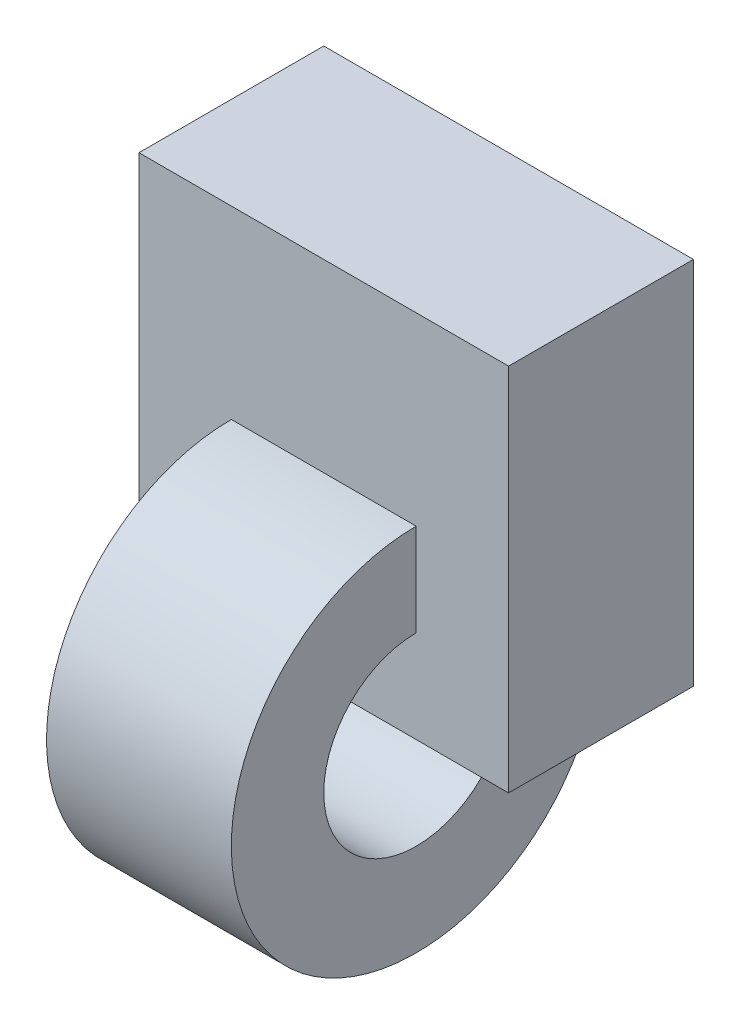
ISO-10303-21;
HEADER;
FILE_DESCRIPTION(('STEP AP214'),'2;1');
FILE_NAME('part.step','',(''),(''),'','','');
FILE_SCHEMA(('AUTOMOTIVE_DESIGN { 1 0 10303 214 1 1 1 1 }'));
ENDSEC;
DATA;
#1=APPLICATION_CONTEXT('core data for automotive mechanical design processes');
#2=APPLICATION_PROTOCOL_DEFINITION('international standard','automotive_design',2000,#1);
#3=PRODUCT_CONTEXT('',#1,'mechanical');
#4=PRODUCT('Part','Part','',(#3));
#5=PRODUCT_RELATED_PRODUCT_CATEGORY('part','',(#4));
#6=PRODUCT_DEFINITION_FORMATION('','',#4);
#7=PRODUCT_DEFINITION_CONTEXT('part definition',#1,'design');
#8=PRODUCT_DEFINITION('design','',#6,#7);
#9=PRODUCT_DEFINITION_SHAPE('','',#8);
#10=(LENGTH_UNIT() NAMED_UNIT(*) SI_UNIT(.MILLI.,.METRE.));
#11=(NAMED_UNIT(*) PLANE_ANGLE_UNIT() SI_UNIT($,.RADIAN.));
#12=(NAMED_UNIT(*) SI_UNIT($,.STERADIAN.) SOLID_ANGLE_UNIT());
#13=UNCERTAINTY_MEASURE_WITH_UNIT(LENGTH_MEASURE(1.E-05),#10,'distance_accuracy_value','');
#14=(GEOMETRIC_REPRESENTATION_CONTEXT(3) GLOBAL_UNCERTAINTY_ASSIGNED_CONTEXT((#13)) GLOBAL_UNIT_ASSIGNED_CONTEXT((#10,
#11,#12)) REPRESENTATION_CONTEXT('',''));
#15=CARTESIAN_POINT('',(0.,0.,0.));
#16=DIRECTION('',(0.,0.,1.));
#17=DIRECTION('',(1.,0.,0.));
#18=AXIS2_PLACEMENT_3D('',#15,#16,#17);
#19=CARTESIAN_POINT('',(0.,0.,10.));
#20=DIRECTION('',(0.,1.,0.));
#21=DIRECTION('',(0.,0.,1.));
#22=AXIS2_PLACEMENT_3D('',#19,#20,#21);
#23=PLANE('',#22);
#24=DIRECTION('',(0.,0.,-1.));
#25=VECTOR('',#24,1.);
#26=CARTESIAN_POINT('',(5.,0.,10.));
#27=LINE('',#26,#25);
#28=CARTESIAN_POINT('',(5.,0.,5.));
#29=VERTEX_POINT('',#28);
#30=CARTESIAN_POINT('',(5.,0.,0.));
#31=VERTEX_POINT('',#30);
#32=EDGE_CURVE('E60',#29,#31,#27,.T.);
#33=ORIENTED_EDGE('',*,*,#32,.F.);
#34=DIRECTION('',(-1.,0.,0.));
#35=VECTOR('',#34,1.);
#36=CARTESIAN_POINT('',(0.,0.,5.));
#37=LINE('',#36,#35);
#38=CARTESIAN_POINT('',(15.,0.,5.));
#39=VERTEX_POINT('',#38);
#40=EDGE_CURVE('E63',#39,#29,#37,.T.);
#41=ORIENTED_EDGE('',*,*,#40,.F.);
#42=DIRECTION('',(0.,0.,1.));
#43=VECTOR('',#42,1.);
#44=CARTESIAN_POINT('',(15.,0.,10.));
#45=LINE('',#44,#43);
#46=CARTESIAN_POINT('',(15.,0.,0.));
#47=VERTEX_POINT('',#46);
#48=EDGE_CURVE('E117',#47,#39,#45,.T.);
#49=ORIENTED_EDGE('',*,*,#48,.F.);
#50=DIRECTION('',(1.,0.,0.));
#51=VECTOR('',#50,1.);
#52=CARTESIAN_POINT('',(0.,0.,0.));
#53=LINE('',#52,#51);
#54=CARTESIAN_POINT('',(20.,0.,0.));
#55=VERTEX_POINT('',#54);
#56=EDGE_CURVE('E106',#47,#55,#53,.T.);
#57=ORIENTED_EDGE('',*,*,#56,.T.);
#58=DIRECTION('',(0.,0.,-1.));
#59=VECTOR('',#58,1.);
#60=CARTESIAN_POINT('',(20.,0.,10.));
#61=LINE('',#60,#59);
#62=CARTESIAN_POINT('',(20.,0.,10.));
#63=VERTEX_POINT('',#62);
#64=EDGE_CURVE('E168',#63,#55,#61,.T.);
#65=ORIENTED_EDGE('',*,*,#64,.F.);
#66=DIRECTION('',(1.,0.,0.));
#67=VECTOR('',#66,1.);
#68=CARTESIAN_POINT('',(0.,0.,10.));
#69=LINE('',#68,#67);
#70=CARTESIAN_POINT('',(0.,0.,10.));
#71=VERTEX_POINT('',#70);
#72=EDGE_CURVE('E153',#71,#63,#69,.T.);
#73=ORIENTED_EDGE('',*,*,#72,.F.);
#74=DIRECTION('',(0.,0.,-1.));
#75=VECTOR('',#74,1.);
#76=CARTESIAN_POINT('',(0.,0.,10.));
#77=LINE('',#76,#75);
#78=CARTESIAN_POINT('',(0.,0.,0.));
#79=VERTEX_POINT('',#78);
#80=EDGE_CURVE('E49',#71,#79,#77,.T.);
#81=ORIENTED_EDGE('',*,*,#80,.T.);
#82=EDGE_CURVE('E119',#79,#31,#53,.T.);
#83=ORIENTED_EDGE('',*,*,#82,.T.);
#84=EDGE_LOOP('',(#33,#41,#49,#57,#65,#73,#81,#83));
#85=FACE_BOUND('',#84,.T.);
#86=ADVANCED_FACE('F45',(#85),#23,.F.);
#87=CARTESIAN_POINT('',(0.,0.,10.));
#88=DIRECTION('',(0.,0.,-1.));
#89=DIRECTION('',(-1.,0.,0.));
#90=AXIS2_PLACEMENT_3D('',#87,#88,#89);
#91=PLANE('',#90);
#92=DIRECTION('',(0.,-1.,0.));
#93=VECTOR('',#92,1.);
#94=CARTESIAN_POINT('',(0.,0.,10.));
#95=LINE('',#94,#93);
#96=CARTESIAN_POINT('',(0.,20.,10.));
#97=VERTEX_POINT('',#96);
#98=EDGE_CURVE('E147',#97,#71,#95,.T.);
#99=ORIENTED_EDGE('',*,*,#98,.T.);
#100=ORIENTED_EDGE('',*,*,#72,.T.);
#101=DIRECTION('',(0.,1.,0.));
#102=VECTOR('',#101,1.);
#103=CARTESIAN_POINT('',(20.,0.,10.));
#104=LINE('',#103,#102);
#105=CARTESIAN_POINT('',(20.,20.,10.));
#106=VERTEX_POINT('',#105);
#107=EDGE_CURVE('E156',#63,#106,#104,.T.);
#108=ORIENTED_EDGE('',*,*,#107,.T.);
#109=DIRECTION('',(-1.,0.,0.));
#110=VECTOR('',#109,1.);
#111=CARTESIAN_POINT('',(0.,20.,10.));
#112=LINE('',#111,#110);
#113=EDGE_CURVE('E158',#106,#97,#112,.T.);
#114=ORIENTED_EDGE('',*,*,#113,.T.);
#115=EDGE_LOOP('',(#99,#100,#108,#114));
#116=FACE_BOUND('',#115,.T.);
#117=DIRECTION('',(0.,-1.,0.));
#118=VECTOR('',#117,1.);
#119=CARTESIAN_POINT('',(5.,0.,10.));
#120=LINE('',#119,#118);
#121=CARTESIAN_POINT('',(5.,10.,10.));
#122=VERTEX_POINT('',#121);
#123=CARTESIAN_POINT('',(5.,5.,10.));
#124=VERTEX_POINT('',#123);
#125=EDGE_CURVE('E144',#122,#124,#120,.T.);
#126=ORIENTED_EDGE('',*,*,#125,.F.);
#127=DIRECTION('',(-1.,0.,0.));
#128=VECTOR('',#127,1.);
#129=CARTESIAN_POINT('',(0.,10.,10.));
#130=LINE('',#129,#128);
#131=CARTESIAN_POINT('',(15.,10.,10.));
#132=VERTEX_POINT('',#131);
#133=EDGE_CURVE('E121',#132,#122,#130,.T.);
#134=ORIENTED_EDGE('',*,*,#133,.F.);
#135=DIRECTION('',(0.,1.,0.));
#136=VECTOR('',#135,1.);
#137=CARTESIAN_POINT('',(15.,0.,10.));
#138=LINE('',#137,#136);
#139=CARTESIAN_POINT('',(15.,5.,10.));
#140=VERTEX_POINT('',#139);
#141=EDGE_CURVE('E124',#140,#132,#138,.T.);
#142=ORIENTED_EDGE('',*,*,#141,.F.);
#143=DIRECTION('',(-1.,0.,0.));
#144=VECTOR('',#143,1.);
#145=CARTESIAN_POINT('',(0.,5.,10.));
#146=LINE('',#145,#144);
#147=EDGE_CURVE('E11',#124,#140,#146,.F.);
#148=ORIENTED_EDGE('',*,*,#147,.F.);
#149=EDGE_LOOP('',(#126,#134,#142,#148));
#150=FACE_BOUND('',#149,.T.);
#151=ADVANCED_FACE('F184',(#116,#150),#91,.F.);
#152=CARTESIAN_POINT('',(0.,0.,10.));
#153=DIRECTION('',(1.,0.,0.));
#154=DIRECTION('',(0.,0.,-1.));
#155=AXIS2_PLACEMENT_3D('',#152,#153,#154);
#156=PLANE('',#155);
#157=DIRECTION('',(0.,-1.,0.));
#158=VECTOR('',#157,1.);
#159=CARTESIAN_POINT('',(0.,0.,0.));
#160=LINE('',#159,#158);
#161=CARTESIAN_POINT('',(0.,20.,0.));
#162=VERTEX_POINT('',#161);
#163=EDGE_CURVE('E113',#162,#79,#160,.T.);
#164=ORIENTED_EDGE('',*,*,#163,.T.);
#165=ORIENTED_EDGE('',*,*,#80,.F.);
#166=ORIENTED_EDGE('',*,*,#98,.F.);
#167=DIRECTION('',(0.,0.,-1.));
#168=VECTOR('',#167,1.);
#169=CARTESIAN_POINT('',(0.,20.,10.));
#170=LINE('',#169,#168);
#171=EDGE_CURVE('E159',#97,#162,#170,.T.);
#172=ORIENTED_EDGE('',*,*,#171,.T.);
#173=EDGE_LOOP('',(#164,#165,#166,#172));
#174=FACE_BOUND('',#173,.T.);
#175=ADVANCED_FACE('F42',(#174),#156,.F.);
#176=CARTESIAN_POINT('',(20.,0.,10.));
#177=DIRECTION('',(-1.,0.,0.));
#178=DIRECTION('',(0.,0.,1.));
#179=AXIS2_PLACEMENT_3D('',#176,#177,#178);
#180=PLANE('',#179);
#181=DIRECTION('',(0.,1.,0.));
#182=VECTOR('',#181,1.);
#183=CARTESIAN_POINT('',(20.,0.,0.));
#184=LINE('',#183,#182);
#185=CARTESIAN_POINT('',(20.,20.,0.));
#186=VERTEX_POINT('',#185);
#187=EDGE_CURVE('E115',#55,#186,#184,.T.);
#188=ORIENTED_EDGE('',*,*,#187,.T.);
#189=DIRECTION('',(0.,0.,-1.));
#190=VECTOR('',#189,1.);
#191=CARTESIAN_POINT('',(20.,20.,10.));
#192=LINE('',#191,#190);
#193=EDGE_CURVE('E170',#106,#186,#192,.T.);
#194=ORIENTED_EDGE('',*,*,#193,.F.);
#195=ORIENTED_EDGE('',*,*,#107,.F.);
#196=ORIENTED_EDGE('',*,*,#64,.T.);
#197=EDGE_LOOP('',(#188,#194,#195,#196));
#198=FACE_BOUND('',#197,.T.);
#199=ADVANCED_FACE('F185',(#198),#180,.F.);
#200=CARTESIAN_POINT('',(0.,20.,10.));
#201=DIRECTION('',(0.,-1.,0.));
#202=DIRECTION('',(0.,0.,-1.));
#203=AXIS2_PLACEMENT_3D('',#200,#201,#202);
#204=PLANE('',#203);
#205=DIRECTION('',(-1.,0.,0.));
#206=VECTOR('',#205,1.);
#207=CARTESIAN_POINT('',(0.,20.,0.));
#208=LINE('',#207,#206);
#209=EDGE_CURVE('E152',#186,#162,#208,.T.);
#210=ORIENTED_EDGE('',*,*,#209,.T.);
#211=ORIENTED_EDGE('',*,*,#171,.F.);
#212=ORIENTED_EDGE('',*,*,#113,.F.);
#213=ORIENTED_EDGE('',*,*,#193,.T.);
#214=EDGE_LOOP('',(#210,#211,#212,#213));
#215=FACE_BOUND('',#214,.T.);
#216=ADVANCED_FACE('F180',(#215),#204,.F.);
#217=CARTESIAN_POINT('',(0.,0.,0.));
#218=DIRECTION('',(0.,0.,-1.));
#219=DIRECTION('',(-1.,0.,0.));
#220=AXIS2_PLACEMENT_3D('',#217,#218,#219);
#221=PLANE('',#220);
#222=ORIENTED_EDGE('',*,*,#163,.F.);
#223=ORIENTED_EDGE('',*,*,#209,.F.);
#224=ORIENTED_EDGE('',*,*,#187,.F.);
#225=ORIENTED_EDGE('',*,*,#56,.F.);
#226=EDGE_CURVE('E109',#31,#47,#53,.T.);
#227=ORIENTED_EDGE('',*,*,#226,.F.);
#228=ORIENTED_EDGE('',*,*,#82,.F.);
#229=EDGE_LOOP('',(#222,#223,#224,#225,#227,#228));
#230=FACE_BOUND('',#229,.T.);
#231=ADVANCED_FACE('F107',(#230),#221,.T.);
#232=CARTESIAN_POINT('',(0.,0.,10.));
#233=DIRECTION('',(-1.,0.,0.));
#234=DIRECTION('',(0.,0.,1.));
#235=AXIS2_PLACEMENT_3D('',#232,#233,#234);
#236=CYLINDRICAL_SURFACE('',#235,5.);
#237=CARTESIAN_POINT('',(15.,0.,10.));
#238=DIRECTION('',(-1.,0.,0.));
#239=DIRECTION('',(0.,0.,1.));
#240=AXIS2_PLACEMENT_3D('',#237,#238,#239);
#241=CIRCLE('',#240,5.);
#242=EDGE_CURVE('E136',#39,#140,#241,.T.);
#243=ORIENTED_EDGE('',*,*,#242,.F.);
#244=ORIENTED_EDGE('',*,*,#40,.T.);
#245=CARTESIAN_POINT('',(5.,0.,10.));
#246=DIRECTION('',(-1.,0.,0.));
#247=DIRECTION('',(0.,0.,1.));
#248=AXIS2_PLACEMENT_3D('',#245,#246,#247);
#249=CIRCLE('',#248,5.);
#250=EDGE_CURVE('E138',#29,#124,#249,.T.);
#251=ORIENTED_EDGE('',*,*,#250,.T.);
#252=ORIENTED_EDGE('',*,*,#147,.T.);
#253=EDGE_LOOP('',(#243,#244,#251,#252));
#254=FACE_BOUND('',#253,.T.);
#255=ADVANCED_FACE('F194',(#254),#236,.F.);
#256=CARTESIAN_POINT('',(5.,5.,10.));
#257=DIRECTION('',(1.,0.,0.));
#258=DIRECTION('',(0.,0.,-1.));
#259=AXIS2_PLACEMENT_3D('',#256,#257,#258);
#260=PLANE('',#259);
#261=ORIENTED_EDGE('',*,*,#250,.F.);
#262=ORIENTED_EDGE('',*,*,#32,.T.);
#263=CARTESIAN_POINT('',(5.,0.,10.));
#264=DIRECTION('',(-1.,0.,0.));
#265=DIRECTION('',(0.,0.,1.));
#266=AXIS2_PLACEMENT_3D('',#263,#264,#265);
#267=CIRCLE('',#266,10.);
#268=EDGE_CURVE('E132',#31,#122,#267,.T.);
#269=ORIENTED_EDGE('',*,*,#268,.T.);
#270=ORIENTED_EDGE('',*,*,#125,.T.);
#271=EDGE_LOOP('',(#261,#262,#269,#270));
#272=FACE_BOUND('',#271,.T.);
#273=ADVANCED_FACE('F191',(#272),#260,.F.);
#274=CARTESIAN_POINT('',(0.,0.,10.));
#275=DIRECTION('',(-1.,0.,0.));
#276=DIRECTION('',(0.,0.,1.));
#277=AXIS2_PLACEMENT_3D('',#274,#275,#276);
#278=CYLINDRICAL_SURFACE('',#277,10.);
#279=CARTESIAN_POINT('',(15.,0.,10.));
#280=DIRECTION('',(-1.,0.,0.));
#281=DIRECTION('',(0.,0.,1.));
#282=AXIS2_PLACEMENT_3D('',#279,#280,#281);
#283=CIRCLE('',#282,10.);
#284=EDGE_CURVE('E133',#47,#132,#283,.T.);
#285=ORIENTED_EDGE('',*,*,#284,.T.);
#286=ORIENTED_EDGE('',*,*,#133,.T.);
#287=ORIENTED_EDGE('',*,*,#268,.F.);
#288=ORIENTED_EDGE('',*,*,#226,.T.);
#289=EDGE_LOOP('',(#285,#286,#287,#288));
#290=FACE_BOUND('',#289,.T.);
#291=ADVANCED_FACE('F129',(#290),#278,.T.);
#292=CARTESIAN_POINT('',(15.,5.,10.));
#293=DIRECTION('',(-1.,0.,0.));
#294=DIRECTION('',(0.,0.,1.));
#295=AXIS2_PLACEMENT_3D('',#292,#293,#294);
#296=PLANE('',#295);
#297=ORIENTED_EDGE('',*,*,#284,.F.);
#298=ORIENTED_EDGE('',*,*,#48,.T.);
#299=ORIENTED_EDGE('',*,*,#242,.T.);
#300=ORIENTED_EDGE('',*,*,#141,.T.);
#301=EDGE_LOOP('',(#297,#298,#299,#300));
#302=FACE_BOUND('',#301,.T.);
#303=ADVANCED_FACE('F131',(#302),#296,.F.);
#304=CLOSED_SHELL('',(#86,#151,#175,#199,#216,#231,#255,#273,#291,#303));
#305=MANIFOLD_SOLID_BREP('B2',#304);
#306=ADVANCED_BREP_SHAPE_REPRESENTATION('',(#18,#305),#14);
#307=SHAPE_DEFINITION_REPRESENTATION(#9,#306);
ENDSEC;
END-ISO-10303-21;
